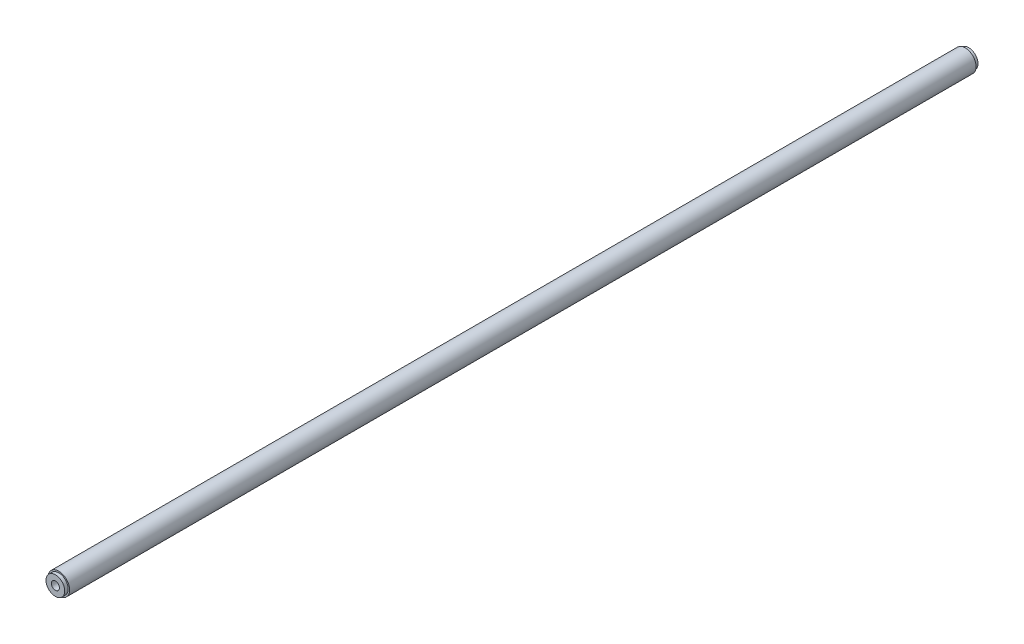
ISO-10303-21;
HEADER;
FILE_DESCRIPTION(('STEP AP214'),'2;1');
FILE_NAME('part.step','',(''),(''),'','','');
FILE_SCHEMA(('AUTOMOTIVE_DESIGN { 1 0 10303 214 1 1 1 1 }'));
ENDSEC;
DATA;
#1=APPLICATION_CONTEXT('core data for automotive mechanical design processes');
#2=APPLICATION_PROTOCOL_DEFINITION('international standard','automotive_design',2000,#1);
#3=PRODUCT_CONTEXT('',#1,'mechanical');
#4=PRODUCT('Part','Part','',(#3));
#5=PRODUCT_RELATED_PRODUCT_CATEGORY('part','',(#4));
#6=PRODUCT_DEFINITION_FORMATION('','',#4);
#7=PRODUCT_DEFINITION_CONTEXT('part definition',#1,'design');
#8=PRODUCT_DEFINITION('design','',#6,#7);
#9=PRODUCT_DEFINITION_SHAPE('','',#8);
#10=(LENGTH_UNIT() NAMED_UNIT(*) SI_UNIT(.MILLI.,.METRE.));
#11=(NAMED_UNIT(*) PLANE_ANGLE_UNIT() SI_UNIT($,.RADIAN.));
#12=(NAMED_UNIT(*) SI_UNIT($,.STERADIAN.) SOLID_ANGLE_UNIT());
#13=UNCERTAINTY_MEASURE_WITH_UNIT(LENGTH_MEASURE(1.E-05),#10,'distance_accuracy_value','');
#14=(GEOMETRIC_REPRESENTATION_CONTEXT(3) GLOBAL_UNCERTAINTY_ASSIGNED_CONTEXT((#13)) GLOBAL_UNIT_ASSIGNED_CONTEXT((#10,
#11,#12)) REPRESENTATION_CONTEXT('',''));
#15=CARTESIAN_POINT('',(0.,0.,0.));
#16=DIRECTION('',(0.,0.,1.));
#17=DIRECTION('',(1.,0.,0.));
#18=AXIS2_PLACEMENT_3D('',#15,#16,#17);
#19=CARTESIAN_POINT('',(0.,0.,531.));
#20=DIRECTION('',(0.,0.,-1.));
#21=DIRECTION('',(-1.,0.,0.));
#22=AXIS2_PLACEMENT_3D('',#19,#20,#21);
#23=CYLINDRICAL_SURFACE('',#22,6.35);
#24=CARTESIAN_POINT('',(0.,0.,531.));
#25=DIRECTION('',(0.,0.,1.));
#26=DIRECTION('',(1.,0.,0.));
#27=AXIS2_PLACEMENT_3D('',#24,#25,#26);
#28=CIRCLE('',#27,6.35);
#29=CARTESIAN_POINT('',(6.35,0.,531.));
#30=VERTEX_POINT('',#29);
#31=EDGE_CURVE('E57',#30,#30,#28,.T.);
#32=ORIENTED_EDGE('',*,*,#31,.F.);
#33=EDGE_LOOP('',(#32));
#34=FACE_BOUND('',#33,.T.);
#35=CARTESIAN_POINT('',(0.,0.,0.));
#36=DIRECTION('',(0.,0.,1.));
#37=DIRECTION('',(1.,0.,0.));
#38=AXIS2_PLACEMENT_3D('',#35,#36,#37);
#39=CIRCLE('',#38,6.35);
#40=CARTESIAN_POINT('',(6.35,0.,0.));
#41=VERTEX_POINT('',#40);
#42=EDGE_CURVE('E66',#41,#41,#39,.T.);
#43=ORIENTED_EDGE('',*,*,#42,.T.);
#44=EDGE_LOOP('',(#43));
#45=FACE_BOUND('',#44,.T.);
#46=ADVANCED_FACE('F43',(#34,#45),#23,.T.);
#47=CARTESIAN_POINT('',(0.,0.,531.));
#48=DIRECTION('',(0.,0.,1.));
#49=DIRECTION('',(1.,0.,0.));
#50=AXIS2_PLACEMENT_3D('',#47,#48,#49);
#51=PLANE('',#50);
#52=CARTESIAN_POINT('',(0.,0.,531.));
#53=DIRECTION('',(0.,0.,1.));
#54=DIRECTION('',(1.,0.,0.));
#55=AXIS2_PLACEMENT_3D('',#52,#53,#54);
#56=CIRCLE('',#55,5.5);
#57=CARTESIAN_POINT('',(5.5,0.,531.));
#58=VERTEX_POINT('',#57);
#59=EDGE_CURVE('E51',#58,#58,#56,.T.);
#60=ORIENTED_EDGE('',*,*,#59,.F.);
#61=EDGE_LOOP('',(#60));
#62=FACE_BOUND('',#61,.T.);
#63=ORIENTED_EDGE('',*,*,#31,.T.);
#64=EDGE_LOOP('',(#63));
#65=FACE_BOUND('',#64,.T.);
#66=ADVANCED_FACE('F78',(#62,#65),#51,.T.);
#67=CARTESIAN_POINT('',(0.,0.,0.));
#68=DIRECTION('',(0.,0.,1.));
#69=DIRECTION('',(1.,0.,0.));
#70=AXIS2_PLACEMENT_3D('',#67,#68,#69);
#71=PLANE('',#70);
#72=CARTESIAN_POINT('',(0.,0.,0.));
#73=DIRECTION('',(0.,0.,-1.));
#74=DIRECTION('',(-1.,0.,0.));
#75=AXIS2_PLACEMENT_3D('',#72,#73,#74);
#76=CIRCLE('',#75,5.5);
#77=CARTESIAN_POINT('',(-5.5,0.,0.));
#78=VERTEX_POINT('',#77);
#79=EDGE_CURVE('E10',#78,#78,#76,.T.);
#80=ORIENTED_EDGE('',*,*,#79,.F.);
#81=EDGE_LOOP('',(#80));
#82=FACE_BOUND('',#81,.T.);
#83=ORIENTED_EDGE('',*,*,#42,.F.);
#84=EDGE_LOOP('',(#83));
#85=FACE_BOUND('',#84,.T.);
#86=ADVANCED_FACE('F75',(#82,#85),#71,.F.);
#87=CARTESIAN_POINT('',(0.,0.,533.));
#88=DIRECTION('',(0.,0.,-1.));
#89=DIRECTION('',(-1.,0.,0.));
#90=AXIS2_PLACEMENT_3D('',#87,#88,#89);
#91=CYLINDRICAL_SURFACE('',#90,5.5);
#92=CARTESIAN_POINT('',(0.,0.,533.));
#93=DIRECTION('',(0.,0.,1.));
#94=DIRECTION('',(1.,0.,0.));
#95=AXIS2_PLACEMENT_3D('',#92,#93,#94);
#96=CIRCLE('',#95,5.5);
#97=CARTESIAN_POINT('',(5.5,0.,533.));
#98=VERTEX_POINT('',#97);
#99=EDGE_CURVE('E63',#98,#98,#96,.T.);
#100=ORIENTED_EDGE('',*,*,#99,.F.);
#101=EDGE_LOOP('',(#100));
#102=FACE_BOUND('',#101,.T.);
#103=ORIENTED_EDGE('',*,*,#59,.T.);
#104=EDGE_LOOP('',(#103));
#105=FACE_BOUND('',#104,.T.);
#106=ADVANCED_FACE('F77',(#102,#105),#91,.T.);
#107=CARTESIAN_POINT('',(0.,0.,533.));
#108=DIRECTION('',(0.,0.,1.));
#109=DIRECTION('',(1.,0.,0.));
#110=AXIS2_PLACEMENT_3D('',#107,#108,#109);
#111=PLANE('',#110);
#112=CARTESIAN_POINT('',(0.,0.,533.));
#113=DIRECTION('',(0.,0.,-1.));
#114=DIRECTION('',(-1.,0.,0.));
#115=AXIS2_PLACEMENT_3D('',#112,#113,#114);
#116=CIRCLE('',#115,2.375);
#117=CARTESIAN_POINT('',(-2.375,0.,533.));
#118=VERTEX_POINT('',#117);
#119=EDGE_CURVE('E156',#118,#118,#116,.T.);
#120=ORIENTED_EDGE('',*,*,#119,.T.);
#121=EDGE_LOOP('',(#120));
#122=FACE_BOUND('',#121,.T.);
#123=ORIENTED_EDGE('',*,*,#99,.T.);
#124=EDGE_LOOP('',(#123));
#125=FACE_BOUND('',#124,.T.);
#126=ADVANCED_FACE('F84',(#122,#125),#111,.T.);
#127=CARTESIAN_POINT('',(0.,0.,-2.));
#128=DIRECTION('',(0.,0.,1.));
#129=DIRECTION('',(1.,0.,0.));
#130=AXIS2_PLACEMENT_3D('',#127,#128,#129);
#131=CYLINDRICAL_SURFACE('',#130,5.5);
#132=CARTESIAN_POINT('',(0.,0.,-2.));
#133=DIRECTION('',(0.,0.,-1.));
#134=DIRECTION('',(-1.,0.,0.));
#135=AXIS2_PLACEMENT_3D('',#132,#133,#134);
#136=CIRCLE('',#135,5.5);
#137=CARTESIAN_POINT('',(-5.5,0.,-2.));
#138=VERTEX_POINT('',#137);
#139=EDGE_CURVE('E61',#138,#138,#136,.T.);
#140=ORIENTED_EDGE('',*,*,#139,.F.);
#141=EDGE_LOOP('',(#140));
#142=FACE_BOUND('',#141,.T.);
#143=ORIENTED_EDGE('',*,*,#79,.T.);
#144=EDGE_LOOP('',(#143));
#145=FACE_BOUND('',#144,.T.);
#146=ADVANCED_FACE('F119',(#142,#145),#131,.T.);
#147=CARTESIAN_POINT('',(0.,0.,-2.));
#148=DIRECTION('',(0.,0.,-1.));
#149=DIRECTION('',(-1.,0.,0.));
#150=AXIS2_PLACEMENT_3D('',#147,#148,#149);
#151=PLANE('',#150);
#152=CARTESIAN_POINT('',(0.,0.,-2.));
#153=DIRECTION('',(0.,0.,-1.));
#154=DIRECTION('',(-1.,0.,0.));
#155=AXIS2_PLACEMENT_3D('',#152,#153,#154);
#156=CIRCLE('',#155,2.375);
#157=CARTESIAN_POINT('',(-2.375,0.,-2.));
#158=VERTEX_POINT('',#157);
#159=EDGE_CURVE('E46',#158,#158,#156,.T.);
#160=ORIENTED_EDGE('',*,*,#159,.F.);
#161=EDGE_LOOP('',(#160));
#162=FACE_BOUND('',#161,.T.);
#163=ORIENTED_EDGE('',*,*,#139,.T.);
#164=EDGE_LOOP('',(#163));
#165=FACE_BOUND('',#164,.T.);
#166=ADVANCED_FACE('F129',(#162,#165),#151,.T.);
#167=CARTESIAN_POINT('',(0.,0.,533.));
#168=DIRECTION('',(0.,0.,-1.));
#169=DIRECTION('',(-1.,0.,0.));
#170=AXIS2_PLACEMENT_3D('',#167,#168,#169);
#171=CYLINDRICAL_SURFACE('',#170,2.375);
#172=ORIENTED_EDGE('',*,*,#159,.T.);
#173=EDGE_LOOP('',(#172));
#174=FACE_BOUND('',#173,.T.);
#175=ORIENTED_EDGE('',*,*,#119,.F.);
#176=EDGE_LOOP('',(#175));
#177=FACE_BOUND('',#176,.T.);
#178=ADVANCED_FACE('F138',(#174,#177),#171,.F.);
#179=CLOSED_SHELL('',(#46,#66,#86,#106,#126,#146,#166,#178));
#180=MANIFOLD_SOLID_BREP('B2',#179);
#181=ADVANCED_BREP_SHAPE_REPRESENTATION('',(#18,#180),#14);
#182=SHAPE_DEFINITION_REPRESENTATION(#9,#181);
ENDSEC;
END-ISO-10303-21;
